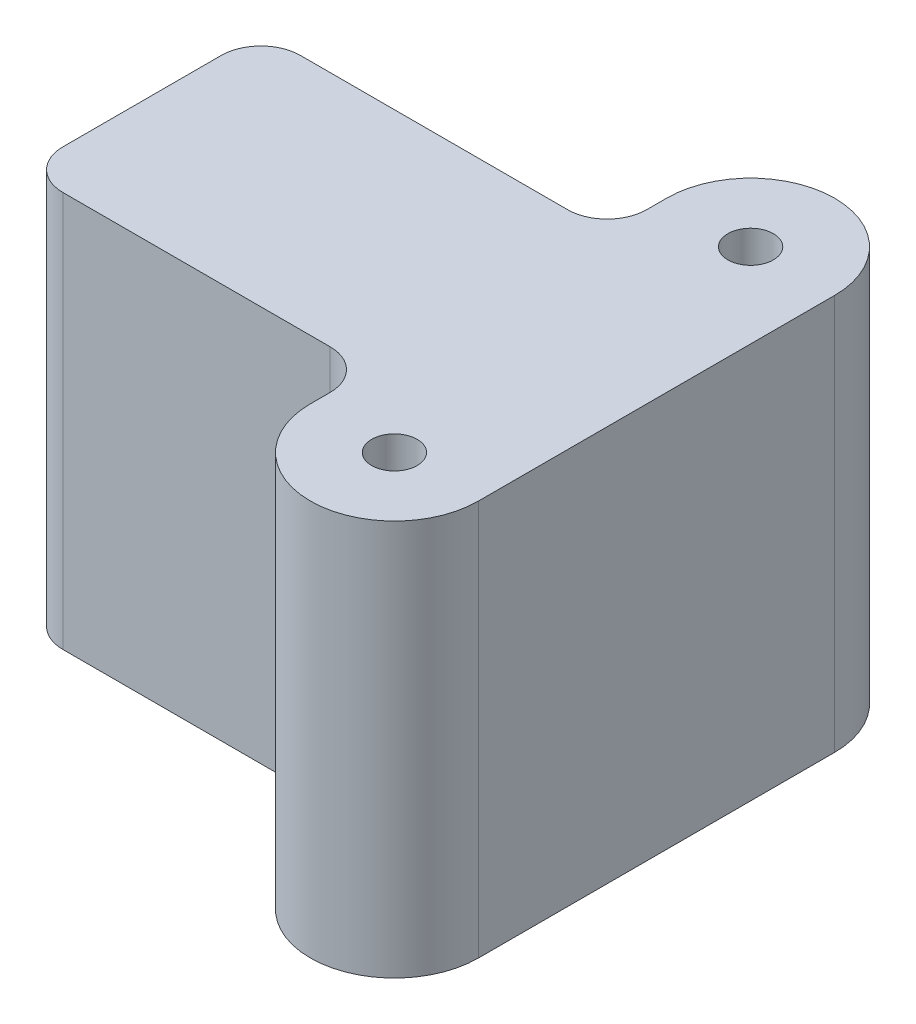
ISO-10303-21;
HEADER;
FILE_DESCRIPTION(('STEP AP214'),'2;1');
FILE_NAME('part.step','',(''),(''),'','','');
FILE_SCHEMA(('AUTOMOTIVE_DESIGN { 1 0 10303 214 1 1 1 1 }'));
ENDSEC;
DATA;
#1=APPLICATION_CONTEXT('core data for automotive mechanical design processes');
#2=APPLICATION_PROTOCOL_DEFINITION('international standard','automotive_design',2000,#1);
#3=PRODUCT_CONTEXT('',#1,'mechanical');
#4=PRODUCT('Part','Part','',(#3));
#5=PRODUCT_RELATED_PRODUCT_CATEGORY('part','',(#4));
#6=PRODUCT_DEFINITION_FORMATION('','',#4);
#7=PRODUCT_DEFINITION_CONTEXT('part definition',#1,'design');
#8=PRODUCT_DEFINITION('design','',#6,#7);
#9=PRODUCT_DEFINITION_SHAPE('','',#8);
#10=(LENGTH_UNIT() NAMED_UNIT(*) SI_UNIT(.MILLI.,.METRE.));
#11=(NAMED_UNIT(*) PLANE_ANGLE_UNIT() SI_UNIT($,.RADIAN.));
#12=(NAMED_UNIT(*) SI_UNIT($,.STERADIAN.) SOLID_ANGLE_UNIT());
#13=UNCERTAINTY_MEASURE_WITH_UNIT(LENGTH_MEASURE(1.E-05),#10,'distance_accuracy_value','');
#14=(GEOMETRIC_REPRESENTATION_CONTEXT(3) GLOBAL_UNCERTAINTY_ASSIGNED_CONTEXT((#13)) GLOBAL_UNIT_ASSIGNED_CONTEXT((#10,
#11,#12)) REPRESENTATION_CONTEXT('',''));
#15=CARTESIAN_POINT('',(0.,0.,0.));
#16=DIRECTION('',(0.,0.,1.));
#17=DIRECTION('',(1.,0.,0.));
#18=AXIS2_PLACEMENT_3D('',#15,#16,#17);
#19=CARTESIAN_POINT('',(0.,20.,0.));
#20=DIRECTION('',(-1.,0.,0.));
#21=DIRECTION('',(0.,0.,1.));
#22=AXIS2_PLACEMENT_3D('',#19,#20,#21);
#23=PLANE('',#22);
#24=DIRECTION('',(0.,0.,-1.));
#25=VECTOR('',#24,1.);
#26=CARTESIAN_POINT('',(0.,0.,0.));
#27=LINE('',#26,#25);
#28=CARTESIAN_POINT('',(0.,0.,9.));
#29=VERTEX_POINT('',#28);
#30=CARTESIAN_POINT('',(0.,0.,-9.));
#31=VERTEX_POINT('',#30);
#32=EDGE_CURVE('E154',#29,#31,#27,.T.);
#33=ORIENTED_EDGE('',*,*,#32,.T.);
#34=DIRECTION('',(0.,-1.,0.));
#35=VECTOR('',#34,1.);
#36=CARTESIAN_POINT('',(0.,20.,-9.));
#37=LINE('',#36,#35);
#38=CARTESIAN_POINT('',(0.,20.,-9.));
#39=VERTEX_POINT('',#38);
#40=EDGE_CURVE('E135',#39,#31,#37,.T.);
#41=ORIENTED_EDGE('',*,*,#40,.F.);
#42=DIRECTION('',(0.,0.,-1.));
#43=VECTOR('',#42,1.);
#44=CARTESIAN_POINT('',(0.,20.,0.));
#45=LINE('',#44,#43);
#46=CARTESIAN_POINT('',(0.,20.,9.));
#47=VERTEX_POINT('',#46);
#48=EDGE_CURVE('E141',#47,#39,#45,.T.);
#49=ORIENTED_EDGE('',*,*,#48,.F.);
#50=DIRECTION('',(0.,-1.,0.));
#51=VECTOR('',#50,1.);
#52=CARTESIAN_POINT('',(0.,20.,9.));
#53=LINE('',#52,#51);
#54=EDGE_CURVE('E223',#47,#29,#53,.T.);
#55=ORIENTED_EDGE('',*,*,#54,.T.);
#56=EDGE_LOOP('',(#33,#41,#49,#55));
#57=FACE_BOUND('',#56,.T.);
#58=ADVANCED_FACE('F39',(#57),#23,.F.);
#59=CARTESIAN_POINT('',(-4.25,20.,-9.));
#60=DIRECTION('',(0.,-1.,0.));
#61=DIRECTION('',(0.,0.,-1.));
#62=AXIS2_PLACEMENT_3D('',#59,#60,#61);
#63=CYLINDRICAL_SURFACE('',#62,4.25);
#64=CARTESIAN_POINT('',(-4.25,0.,-9.));
#65=DIRECTION('',(0.,1.,0.));
#66=DIRECTION('',(0.,0.,1.));
#67=AXIS2_PLACEMENT_3D('',#64,#65,#66);
#68=CIRCLE('',#67,4.25);
#69=CARTESIAN_POINT('',(-8.5,0.,-9.));
#70=VERTEX_POINT('',#69);
#71=EDGE_CURVE('E228',#31,#70,#68,.T.);
#72=ORIENTED_EDGE('',*,*,#71,.T.);
#73=DIRECTION('',(0.,-1.,0.));
#74=VECTOR('',#73,1.);
#75=CARTESIAN_POINT('',(-8.5,20.,-9.));
#76=LINE('',#75,#74);
#77=CARTESIAN_POINT('',(-8.5,20.,-9.));
#78=VERTEX_POINT('',#77);
#79=EDGE_CURVE('E138',#78,#70,#76,.T.);
#80=ORIENTED_EDGE('',*,*,#79,.F.);
#81=CARTESIAN_POINT('',(-4.25,20.,-9.));
#82=DIRECTION('',(0.,1.,0.));
#83=DIRECTION('',(0.,0.,1.));
#84=AXIS2_PLACEMENT_3D('',#81,#82,#83);
#85=CIRCLE('',#84,4.25);
#86=EDGE_CURVE('E130',#39,#78,#85,.T.);
#87=ORIENTED_EDGE('',*,*,#86,.F.);
#88=ORIENTED_EDGE('',*,*,#40,.T.);
#89=EDGE_LOOP('',(#72,#80,#87,#88));
#90=FACE_BOUND('',#89,.T.);
#91=ADVANCED_FACE('F133',(#90),#63,.T.);
#92=CARTESIAN_POINT('',(-8.50000000000001,20.,0.));
#93=DIRECTION('',(-1.,0.,0.));
#94=DIRECTION('',(0.,0.,1.));
#95=AXIS2_PLACEMENT_3D('',#92,#93,#94);
#96=PLANE('',#95);
#97=DIRECTION('',(0.,0.,-1.));
#98=VECTOR('',#97,1.);
#99=CARTESIAN_POINT('',(-8.50000000000001,0.,0.));
#100=LINE('',#99,#98);
#101=CARTESIAN_POINT('',(-8.5,0.,-8.));
#102=VERTEX_POINT('',#101);
#103=EDGE_CURVE('E230',#102,#70,#100,.T.);
#104=ORIENTED_EDGE('',*,*,#103,.F.);
#105=DIRECTION('',(0.,-1.,0.));
#106=VECTOR('',#105,1.);
#107=CARTESIAN_POINT('',(-8.5,20.,-8.));
#108=LINE('',#107,#106);
#109=CARTESIAN_POINT('',(-8.5,20.,-8.));
#110=VERTEX_POINT('',#109);
#111=EDGE_CURVE('E182',#102,#110,#108,.F.);
#112=ORIENTED_EDGE('',*,*,#111,.T.);
#113=DIRECTION('',(0.,0.,-1.));
#114=VECTOR('',#113,1.);
#115=CARTESIAN_POINT('',(-8.50000000000001,20.,0.));
#116=LINE('',#115,#114);
#117=EDGE_CURVE('E140',#110,#78,#116,.T.);
#118=ORIENTED_EDGE('',*,*,#117,.T.);
#119=ORIENTED_EDGE('',*,*,#79,.T.);
#120=EDGE_LOOP('',(#104,#112,#118,#119));
#121=FACE_BOUND('',#120,.T.);
#122=ADVANCED_FACE('F249',(#121),#96,.T.);
#123=CARTESIAN_POINT('',(0.,20.,-6.));
#124=DIRECTION('',(0.,0.,1.));
#125=DIRECTION('',(1.,0.,0.));
#126=AXIS2_PLACEMENT_3D('',#123,#124,#125);
#127=PLANE('',#126);
#128=DIRECTION('',(-1.,0.,0.));
#129=VECTOR('',#128,1.);
#130=CARTESIAN_POINT('',(0.,0.,-6.));
#131=LINE('',#130,#129);
#132=CARTESIAN_POINT('',(-10.5,0.,-6.));
#133=VERTEX_POINT('',#132);
#134=CARTESIAN_POINT('',(-24.,0.,-6.));
#135=VERTEX_POINT('',#134);
#136=EDGE_CURVE('E232',#133,#135,#131,.T.);
#137=ORIENTED_EDGE('',*,*,#136,.T.);
#138=DIRECTION('',(0.,-1.,0.));
#139=VECTOR('',#138,1.);
#140=CARTESIAN_POINT('',(-24.,20.,-6.));
#141=LINE('',#140,#139);
#142=CARTESIAN_POINT('',(-24.,20.,-6.));
#143=VERTEX_POINT('',#142);
#144=EDGE_CURVE('E60',#135,#143,#141,.F.);
#145=ORIENTED_EDGE('',*,*,#144,.T.);
#146=DIRECTION('',(-1.,0.,0.));
#147=VECTOR('',#146,1.);
#148=CARTESIAN_POINT('',(0.,20.,-6.));
#149=LINE('',#148,#147);
#150=CARTESIAN_POINT('',(-10.5,20.,-6.));
#151=VERTEX_POINT('',#150);
#152=EDGE_CURVE('E251',#151,#143,#149,.T.);
#153=ORIENTED_EDGE('',*,*,#152,.F.);
#154=DIRECTION('',(0.,-1.,0.));
#155=VECTOR('',#154,1.);
#156=CARTESIAN_POINT('',(-10.5,20.,-6.));
#157=LINE('',#156,#155);
#158=EDGE_CURVE('E178',#151,#133,#157,.T.);
#159=ORIENTED_EDGE('',*,*,#158,.T.);
#160=EDGE_LOOP('',(#137,#145,#153,#159));
#161=FACE_BOUND('',#160,.T.);
#162=ADVANCED_FACE('F266',(#161),#127,.F.);
#163=CARTESIAN_POINT('',(-26.,20.,0.));
#164=DIRECTION('',(1.,0.,0.));
#165=DIRECTION('',(0.,0.,-1.));
#166=AXIS2_PLACEMENT_3D('',#163,#164,#165);
#167=PLANE('',#166);
#168=DIRECTION('',(0.,0.,1.));
#169=VECTOR('',#168,1.);
#170=CARTESIAN_POINT('',(-26.,0.,0.));
#171=LINE('',#170,#169);
#172=CARTESIAN_POINT('',(-26.,0.,-4.));
#173=VERTEX_POINT('',#172);
#174=CARTESIAN_POINT('',(-26.,0.,4.));
#175=VERTEX_POINT('',#174);
#176=EDGE_CURVE('E206',#173,#175,#171,.T.);
#177=ORIENTED_EDGE('',*,*,#176,.T.);
#178=DIRECTION('',(0.,-1.,0.));
#179=VECTOR('',#178,1.);
#180=CARTESIAN_POINT('',(-26.,20.,4.));
#181=LINE('',#180,#179);
#182=CARTESIAN_POINT('',(-26.,20.,4.));
#183=VERTEX_POINT('',#182);
#184=EDGE_CURVE('E172',#175,#183,#181,.F.);
#185=ORIENTED_EDGE('',*,*,#184,.T.);
#186=DIRECTION('',(0.,0.,1.));
#187=VECTOR('',#186,1.);
#188=CARTESIAN_POINT('',(-26.,20.,0.));
#189=LINE('',#188,#187);
#190=CARTESIAN_POINT('',(-26.,20.,-4.));
#191=VERTEX_POINT('',#190);
#192=EDGE_CURVE('E217',#191,#183,#189,.T.);
#193=ORIENTED_EDGE('',*,*,#192,.F.);
#194=DIRECTION('',(0.,-1.,0.));
#195=VECTOR('',#194,1.);
#196=CARTESIAN_POINT('',(-26.,20.,-4.));
#197=LINE('',#196,#195);
#198=EDGE_CURVE('E169',#191,#173,#197,.T.);
#199=ORIENTED_EDGE('',*,*,#198,.T.);
#200=EDGE_LOOP('',(#177,#185,#193,#199));
#201=FACE_BOUND('',#200,.T.);
#202=ADVANCED_FACE('F263',(#201),#167,.F.);
#203=CARTESIAN_POINT('',(0.,20.,6.));
#204=DIRECTION('',(0.,0.,1.));
#205=DIRECTION('',(1.,0.,0.));
#206=AXIS2_PLACEMENT_3D('',#203,#204,#205);
#207=PLANE('',#206);
#208=DIRECTION('',(-1.,0.,0.));
#209=VECTOR('',#208,1.);
#210=CARTESIAN_POINT('',(0.,20.,6.));
#211=LINE('',#210,#209);
#212=CARTESIAN_POINT('',(-10.5,20.,6.));
#213=VERTEX_POINT('',#212);
#214=CARTESIAN_POINT('',(-24.,20.,6.));
#215=VERTEX_POINT('',#214);
#216=EDGE_CURVE('E213',#213,#215,#211,.T.);
#217=ORIENTED_EDGE('',*,*,#216,.T.);
#218=DIRECTION('',(0.,-1.,0.));
#219=VECTOR('',#218,1.);
#220=CARTESIAN_POINT('',(-24.,0.,6.));
#221=LINE('',#220,#219);
#222=CARTESIAN_POINT('',(-24.,0.,6.));
#223=VERTEX_POINT('',#222);
#224=EDGE_CURVE('E157',#215,#223,#221,.T.);
#225=ORIENTED_EDGE('',*,*,#224,.T.);
#226=DIRECTION('',(-1.,0.,0.));
#227=VECTOR('',#226,1.);
#228=CARTESIAN_POINT('',(0.,0.,6.));
#229=LINE('',#228,#227);
#230=CARTESIAN_POINT('',(-10.5,0.,6.));
#231=VERTEX_POINT('',#230);
#232=EDGE_CURVE('E196',#231,#223,#229,.T.);
#233=ORIENTED_EDGE('',*,*,#232,.F.);
#234=DIRECTION('',(0.,-1.,0.));
#235=VECTOR('',#234,1.);
#236=CARTESIAN_POINT('',(-10.5,20.,6.));
#237=LINE('',#236,#235);
#238=EDGE_CURVE('E155',#231,#213,#237,.F.);
#239=ORIENTED_EDGE('',*,*,#238,.T.);
#240=EDGE_LOOP('',(#217,#225,#233,#239));
#241=FACE_BOUND('',#240,.T.);
#242=ADVANCED_FACE('F204',(#241),#207,.T.);
#243=CARTESIAN_POINT('',(-8.50000000000001,20.,0.));
#244=DIRECTION('',(1.,0.,0.));
#245=DIRECTION('',(0.,0.,-1.));
#246=AXIS2_PLACEMENT_3D('',#243,#244,#245);
#247=PLANE('',#246);
#248=DIRECTION('',(0.,0.,1.));
#249=VECTOR('',#248,1.);
#250=CARTESIAN_POINT('',(-8.50000000000001,20.,0.));
#251=LINE('',#250,#249);
#252=CARTESIAN_POINT('',(-8.5,20.,8.));
#253=VERTEX_POINT('',#252);
#254=CARTESIAN_POINT('',(-8.5,20.,9.));
#255=VERTEX_POINT('',#254);
#256=EDGE_CURVE('E212',#253,#255,#251,.T.);
#257=ORIENTED_EDGE('',*,*,#256,.F.);
#258=DIRECTION('',(0.,-1.,0.));
#259=VECTOR('',#258,1.);
#260=CARTESIAN_POINT('',(-8.5,20.,8.));
#261=LINE('',#260,#259);
#262=CARTESIAN_POINT('',(-8.5,0.,8.));
#263=VERTEX_POINT('',#262);
#264=EDGE_CURVE('E184',#253,#263,#261,.T.);
#265=ORIENTED_EDGE('',*,*,#264,.T.);
#266=DIRECTION('',(0.,0.,1.));
#267=VECTOR('',#266,1.);
#268=CARTESIAN_POINT('',(-8.50000000000001,0.,0.));
#269=LINE('',#268,#267);
#270=CARTESIAN_POINT('',(-8.5,0.,9.));
#271=VERTEX_POINT('',#270);
#272=EDGE_CURVE('E198',#263,#271,#269,.T.);
#273=ORIENTED_EDGE('',*,*,#272,.T.);
#274=DIRECTION('',(0.,-1.,0.));
#275=VECTOR('',#274,1.);
#276=CARTESIAN_POINT('',(-8.5,20.,9.));
#277=LINE('',#276,#275);
#278=EDGE_CURVE('E159',#255,#271,#277,.T.);
#279=ORIENTED_EDGE('',*,*,#278,.F.);
#280=EDGE_LOOP('',(#257,#265,#273,#279));
#281=FACE_BOUND('',#280,.T.);
#282=ADVANCED_FACE('F209',(#281),#247,.F.);
#283=CARTESIAN_POINT('',(-4.25,20.,9.));
#284=DIRECTION('',(0.,-1.,0.));
#285=DIRECTION('',(0.,0.,-1.));
#286=AXIS2_PLACEMENT_3D('',#283,#284,#285);
#287=CYLINDRICAL_SURFACE('',#286,4.25);
#288=CARTESIAN_POINT('',(-4.25,0.,9.));
#289=DIRECTION('',(0.,1.,0.));
#290=DIRECTION('',(0.,0.,1.));
#291=AXIS2_PLACEMENT_3D('',#288,#289,#290);
#292=CIRCLE('',#291,4.25);
#293=EDGE_CURVE('E237',#29,#271,#292,.F.);
#294=ORIENTED_EDGE('',*,*,#293,.F.);
#295=ORIENTED_EDGE('',*,*,#54,.F.);
#296=CARTESIAN_POINT('',(-4.25,20.,9.));
#297=DIRECTION('',(0.,1.,0.));
#298=DIRECTION('',(0.,0.,1.));
#299=AXIS2_PLACEMENT_3D('',#296,#297,#298);
#300=CIRCLE('',#299,4.25);
#301=EDGE_CURVE('E149',#47,#255,#300,.F.);
#302=ORIENTED_EDGE('',*,*,#301,.T.);
#303=ORIENTED_EDGE('',*,*,#278,.T.);
#304=EDGE_LOOP('',(#294,#295,#302,#303));
#305=FACE_BOUND('',#304,.T.);
#306=ADVANCED_FACE('F244',(#305),#287,.T.);
#307=CARTESIAN_POINT('',(-4.25,20.,-9.));
#308=DIRECTION('',(0.,-1.,0.));
#309=DIRECTION('',(0.,0.,-1.));
#310=AXIS2_PLACEMENT_3D('',#307,#308,#309);
#311=CYLINDRICAL_SURFACE('',#310,1.15);
#312=CARTESIAN_POINT('',(-4.25,20.,-9.));
#313=DIRECTION('',(0.,1.,0.));
#314=DIRECTION('',(0.,0.,1.));
#315=AXIS2_PLACEMENT_3D('',#312,#313,#314);
#316=CIRCLE('',#315,1.15);
#317=CARTESIAN_POINT('',(-4.25,20.,-7.85));
#318=VERTEX_POINT('',#317);
#319=EDGE_CURVE('E151',#318,#318,#316,.T.);
#320=ORIENTED_EDGE('',*,*,#319,.T.);
#321=EDGE_LOOP('',(#320));
#322=FACE_BOUND('',#321,.T.);
#323=CARTESIAN_POINT('',(-4.25,0.,-9.));
#324=DIRECTION('',(0.,1.,0.));
#325=DIRECTION('',(0.,0.,1.));
#326=AXIS2_PLACEMENT_3D('',#323,#324,#325);
#327=CIRCLE('',#326,1.15);
#328=CARTESIAN_POINT('',(-4.25,0.,-7.85));
#329=VERTEX_POINT('',#328);
#330=EDGE_CURVE('E224',#329,#329,#327,.T.);
#331=ORIENTED_EDGE('',*,*,#330,.F.);
#332=EDGE_LOOP('',(#331));
#333=FACE_BOUND('',#332,.T.);
#334=ADVANCED_FACE('F284',(#322,#333),#311,.F.);
#335=CARTESIAN_POINT('',(-4.25,20.,9.));
#336=DIRECTION('',(0.,-1.,0.));
#337=DIRECTION('',(0.,0.,-1.));
#338=AXIS2_PLACEMENT_3D('',#335,#336,#337);
#339=CYLINDRICAL_SURFACE('',#338,1.15);
#340=CARTESIAN_POINT('',(-4.25,20.,9.));
#341=DIRECTION('',(0.,1.,0.));
#342=DIRECTION('',(0.,0.,1.));
#343=AXIS2_PLACEMENT_3D('',#340,#341,#342);
#344=CIRCLE('',#343,1.15);
#345=CARTESIAN_POINT('',(-4.25,20.,10.15));
#346=VERTEX_POINT('',#345);
#347=EDGE_CURVE('E215',#346,#346,#344,.F.);
#348=ORIENTED_EDGE('',*,*,#347,.F.);
#349=EDGE_LOOP('',(#348));
#350=FACE_BOUND('',#349,.T.);
#351=CARTESIAN_POINT('',(-4.25,0.,9.));
#352=DIRECTION('',(0.,1.,0.));
#353=DIRECTION('',(0.,0.,1.));
#354=AXIS2_PLACEMENT_3D('',#351,#352,#353);
#355=CIRCLE('',#354,1.15);
#356=CARTESIAN_POINT('',(-4.25,0.,10.15));
#357=VERTEX_POINT('',#356);
#358=EDGE_CURVE('E239',#357,#357,#355,.F.);
#359=ORIENTED_EDGE('',*,*,#358,.T.);
#360=EDGE_LOOP('',(#359));
#361=FACE_BOUND('',#360,.T.);
#362=ADVANCED_FACE('F287',(#350,#361),#339,.F.);
#363=CARTESIAN_POINT('',(0.,20.,0.));
#364=DIRECTION('',(0.,1.,0.));
#365=DIRECTION('',(0.,0.,1.));
#366=AXIS2_PLACEMENT_3D('',#363,#364,#365);
#367=PLANE('',#366);
#368=ORIENTED_EDGE('',*,*,#319,.F.);
#369=EDGE_LOOP('',(#368));
#370=FACE_BOUND('',#369,.T.);
#371=ORIENTED_EDGE('',*,*,#192,.T.);
#372=CARTESIAN_POINT('',(-24.,20.,4.));
#373=DIRECTION('',(0.,1.,0.));
#374=DIRECTION('',(0.,0.,1.));
#375=AXIS2_PLACEMENT_3D('',#372,#373,#374);
#376=CIRCLE('',#375,2.);
#377=EDGE_CURVE('E176',#183,#215,#376,.T.);
#378=ORIENTED_EDGE('',*,*,#377,.T.);
#379=ORIENTED_EDGE('',*,*,#216,.F.);
#380=CARTESIAN_POINT('',(-10.5,20.,8.));
#381=DIRECTION('',(0.,1.,0.));
#382=DIRECTION('',(0.,0.,1.));
#383=AXIS2_PLACEMENT_3D('',#380,#381,#382);
#384=CIRCLE('',#383,2.);
#385=EDGE_CURVE('E11',#213,#253,#384,.F.);
#386=ORIENTED_EDGE('',*,*,#385,.T.);
#387=ORIENTED_EDGE('',*,*,#256,.T.);
#388=ORIENTED_EDGE('',*,*,#301,.F.);
#389=ORIENTED_EDGE('',*,*,#48,.T.);
#390=ORIENTED_EDGE('',*,*,#86,.T.);
#391=ORIENTED_EDGE('',*,*,#117,.F.);
#392=CARTESIAN_POINT('',(-10.5,20.,-8.));
#393=DIRECTION('',(0.,1.,0.));
#394=DIRECTION('',(0.,0.,1.));
#395=AXIS2_PLACEMENT_3D('',#392,#393,#394);
#396=CIRCLE('',#395,2.);
#397=EDGE_CURVE('E189',#110,#151,#396,.F.);
#398=ORIENTED_EDGE('',*,*,#397,.T.);
#399=ORIENTED_EDGE('',*,*,#152,.T.);
#400=CARTESIAN_POINT('',(-24.,20.,-4.));
#401=DIRECTION('',(0.,1.,0.));
#402=DIRECTION('',(0.,0.,1.));
#403=AXIS2_PLACEMENT_3D('',#400,#401,#402);
#404=CIRCLE('',#403,2.);
#405=EDGE_CURVE('E174',#143,#191,#404,.T.);
#406=ORIENTED_EDGE('',*,*,#405,.T.);
#407=EDGE_LOOP('',(#371,#378,#379,#386,#387,#388,#389,#390,#391,#398,#399,#406));
#408=FACE_BOUND('',#407,.T.);
#409=ORIENTED_EDGE('',*,*,#347,.T.);
#410=EDGE_LOOP('',(#409));
#411=FACE_BOUND('',#410,.T.);
#412=ADVANCED_FACE('F146',(#370,#408,#411),#367,.T.);
#413=CARTESIAN_POINT('',(0.,0.,0.));
#414=DIRECTION('',(0.,1.,0.));
#415=DIRECTION('',(0.,0.,1.));
#416=AXIS2_PLACEMENT_3D('',#413,#414,#415);
#417=PLANE('',#416);
#418=ORIENTED_EDGE('',*,*,#330,.T.);
#419=EDGE_LOOP('',(#418));
#420=FACE_BOUND('',#419,.T.);
#421=ORIENTED_EDGE('',*,*,#232,.T.);
#422=CARTESIAN_POINT('',(-24.,0.,4.));
#423=DIRECTION('',(0.,1.,0.));
#424=DIRECTION('',(0.,0.,1.));
#425=AXIS2_PLACEMENT_3D('',#422,#423,#424);
#426=CIRCLE('',#425,2.);
#427=EDGE_CURVE('E167',#223,#175,#426,.F.);
#428=ORIENTED_EDGE('',*,*,#427,.T.);
#429=ORIENTED_EDGE('',*,*,#176,.F.);
#430=CARTESIAN_POINT('',(-24.,0.,-4.));
#431=DIRECTION('',(0.,1.,0.));
#432=DIRECTION('',(0.,0.,1.));
#433=AXIS2_PLACEMENT_3D('',#430,#431,#432);
#434=CIRCLE('',#433,2.);
#435=EDGE_CURVE('E165',#173,#135,#434,.F.);
#436=ORIENTED_EDGE('',*,*,#435,.T.);
#437=ORIENTED_EDGE('',*,*,#136,.F.);
#438=CARTESIAN_POINT('',(-10.5,0.,-8.));
#439=DIRECTION('',(0.,1.,0.));
#440=DIRECTION('',(0.,0.,1.));
#441=AXIS2_PLACEMENT_3D('',#438,#439,#440);
#442=CIRCLE('',#441,2.);
#443=EDGE_CURVE('E187',#133,#102,#442,.T.);
#444=ORIENTED_EDGE('',*,*,#443,.T.);
#445=ORIENTED_EDGE('',*,*,#103,.T.);
#446=ORIENTED_EDGE('',*,*,#71,.F.);
#447=ORIENTED_EDGE('',*,*,#32,.F.);
#448=ORIENTED_EDGE('',*,*,#293,.T.);
#449=ORIENTED_EDGE('',*,*,#272,.F.);
#450=CARTESIAN_POINT('',(-10.5,0.,8.));
#451=DIRECTION('',(0.,1.,0.));
#452=DIRECTION('',(0.,0.,1.));
#453=AXIS2_PLACEMENT_3D('',#450,#451,#452);
#454=CIRCLE('',#453,2.);
#455=EDGE_CURVE('E47',#263,#231,#454,.T.);
#456=ORIENTED_EDGE('',*,*,#455,.T.);
#457=EDGE_LOOP('',(#421,#428,#429,#436,#437,#444,#445,#446,#447,#448,#449,#456));
#458=FACE_BOUND('',#457,.T.);
#459=ORIENTED_EDGE('',*,*,#358,.F.);
#460=EDGE_LOOP('',(#459));
#461=FACE_BOUND('',#460,.T.);
#462=ADVANCED_FACE('F194',(#420,#458,#461),#417,.F.);
#463=CARTESIAN_POINT('',(-24.,20.,4.));
#464=DIRECTION('',(0.,1.,0.));
#465=DIRECTION('',(0.,0.,1.));
#466=AXIS2_PLACEMENT_3D('',#463,#464,#465);
#467=CYLINDRICAL_SURFACE('',#466,2.);
#468=ORIENTED_EDGE('',*,*,#377,.F.);
#469=ORIENTED_EDGE('',*,*,#184,.F.);
#470=ORIENTED_EDGE('',*,*,#427,.F.);
#471=ORIENTED_EDGE('',*,*,#224,.F.);
#472=EDGE_LOOP('',(#468,#469,#470,#471));
#473=FACE_BOUND('',#472,.T.);
#474=ADVANCED_FACE('F261',(#473),#467,.T.);
#475=CARTESIAN_POINT('',(-24.,20.,-4.));
#476=DIRECTION('',(0.,-1.,0.));
#477=DIRECTION('',(0.,0.,-1.));
#478=AXIS2_PLACEMENT_3D('',#475,#476,#477);
#479=CYLINDRICAL_SURFACE('',#478,2.);
#480=ORIENTED_EDGE('',*,*,#405,.F.);
#481=ORIENTED_EDGE('',*,*,#144,.F.);
#482=ORIENTED_EDGE('',*,*,#435,.F.);
#483=ORIENTED_EDGE('',*,*,#198,.F.);
#484=EDGE_LOOP('',(#480,#481,#482,#483));
#485=FACE_BOUND('',#484,.T.);
#486=ADVANCED_FACE('F265',(#485),#479,.T.);
#487=CARTESIAN_POINT('',(-10.5,20.,-8.));
#488=DIRECTION('',(0.,-1.,0.));
#489=DIRECTION('',(0.,0.,-1.));
#490=AXIS2_PLACEMENT_3D('',#487,#488,#489);
#491=CYLINDRICAL_SURFACE('',#490,2.);
#492=ORIENTED_EDGE('',*,*,#397,.F.);
#493=ORIENTED_EDGE('',*,*,#111,.F.);
#494=ORIENTED_EDGE('',*,*,#443,.F.);
#495=ORIENTED_EDGE('',*,*,#158,.F.);
#496=EDGE_LOOP('',(#492,#493,#494,#495));
#497=FACE_BOUND('',#496,.T.);
#498=ADVANCED_FACE('F269',(#497),#491,.F.);
#499=CARTESIAN_POINT('',(-10.5,20.,8.));
#500=DIRECTION('',(0.,-1.,0.));
#501=DIRECTION('',(0.,0.,-1.));
#502=AXIS2_PLACEMENT_3D('',#499,#500,#501);
#503=CYLINDRICAL_SURFACE('',#502,2.);
#504=ORIENTED_EDGE('',*,*,#385,.F.);
#505=ORIENTED_EDGE('',*,*,#238,.F.);
#506=ORIENTED_EDGE('',*,*,#455,.F.);
#507=ORIENTED_EDGE('',*,*,#264,.F.);
#508=EDGE_LOOP('',(#504,#505,#506,#507));
#509=FACE_BOUND('',#508,.T.);
#510=ADVANCED_FACE('F41',(#509),#503,.F.);
#511=CLOSED_SHELL('',(#58,#91,#122,#162,#202,#242,#282,#306,#334,#362,#412,#462,#474,#486,#498,#510));
#512=MANIFOLD_SOLID_BREP('B2',#511);
#513=ADVANCED_BREP_SHAPE_REPRESENTATION('',(#18,#512),#14);
#514=SHAPE_DEFINITION_REPRESENTATION(#9,#513);
ENDSEC;
END-ISO-10303-21;
